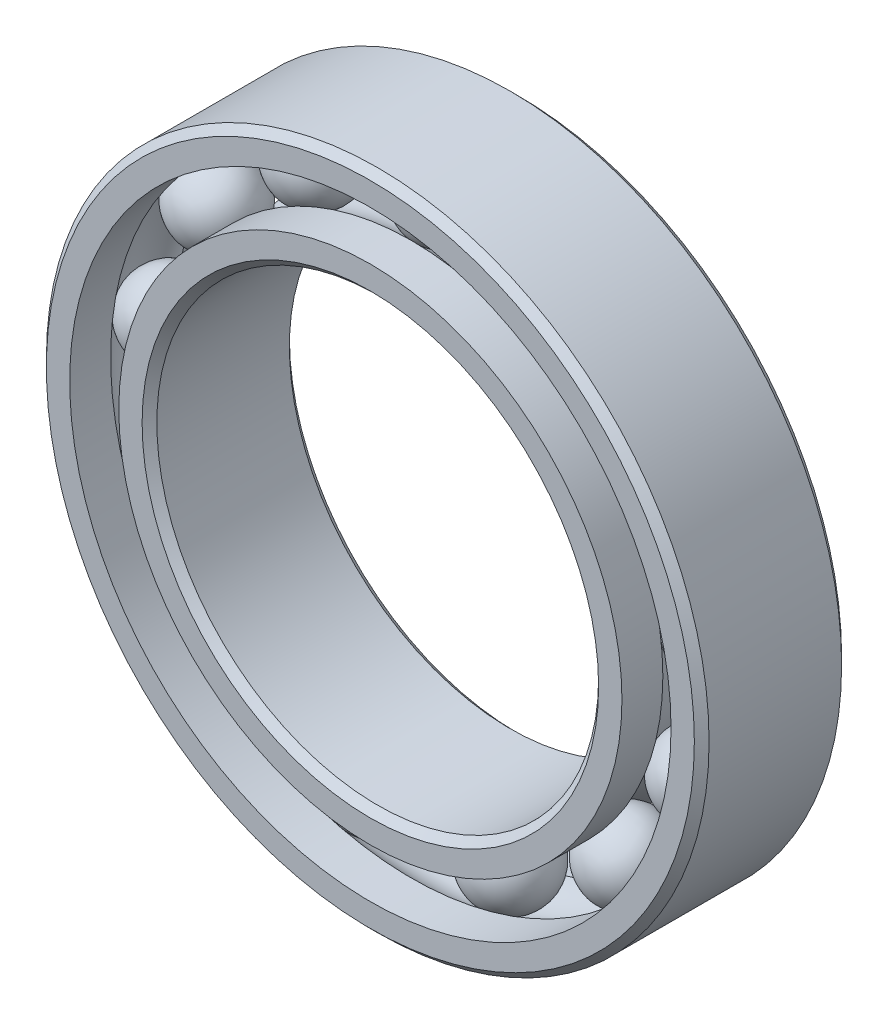
ISO-10303-21;
HEADER;
FILE_DESCRIPTION(('STEP AP214'),'2;1');
FILE_NAME('part.step','',(''),(''),'','','');
FILE_SCHEMA(('AUTOMOTIVE_DESIGN { 1 0 10303 214 1 1 1 1 }'));
ENDSEC;
DATA;
#1=APPLICATION_CONTEXT('core data for automotive mechanical design processes');
#2=APPLICATION_PROTOCOL_DEFINITION('international standard','automotive_design',2000,#1);
#3=PRODUCT_CONTEXT('',#1,'mechanical');
#4=PRODUCT('Part','Part','',(#3));
#5=PRODUCT_RELATED_PRODUCT_CATEGORY('part','',(#4));
#6=PRODUCT_DEFINITION_FORMATION('','',#4);
#7=PRODUCT_DEFINITION_CONTEXT('part definition',#1,'design');
#8=PRODUCT_DEFINITION('design','',#6,#7);
#9=PRODUCT_DEFINITION_SHAPE('','',#8);
#10=(LENGTH_UNIT() NAMED_UNIT(*) SI_UNIT(.MILLI.,.METRE.));
#11=(NAMED_UNIT(*) PLANE_ANGLE_UNIT() SI_UNIT($,.RADIAN.));
#12=(NAMED_UNIT(*) SI_UNIT($,.STERADIAN.) SOLID_ANGLE_UNIT());
#13=UNCERTAINTY_MEASURE_WITH_UNIT(LENGTH_MEASURE(1.E-05),#10,'distance_accuracy_value','');
#14=(GEOMETRIC_REPRESENTATION_CONTEXT(3) GLOBAL_UNCERTAINTY_ASSIGNED_CONTEXT((#13)) GLOBAL_UNIT_ASSIGNED_CONTEXT((#10,
#11,#12)) REPRESENTATION_CONTEXT('',''));
#15=CARTESIAN_POINT('',(0.,0.,0.));
#16=DIRECTION('',(0.,0.,1.));
#17=DIRECTION('',(1.,0.,0.));
#18=AXIS2_PLACEMENT_3D('',#15,#16,#17);
#19=CARTESIAN_POINT('',(3.48542379032818,6.64092019239912,0.));
#20=DIRECTION('',(0.,0.,1.));
#21=DIRECTION('',(0.464723172043757,0.885456025653216,0.));
#22=AXIS2_PLACEMENT_3D('',#19,#20,#21);
#23=SPHERICAL_SURFACE('',#22,1.11111111111111);
#24=CARTESIAN_POINT('',(3.48542379032818,6.64092019239912,1.11111111111111));
#25=VERTEX_POINT('',#24);
#26=VERTEX_LOOP('',#25);
#27=FACE_BOUND('',#26,.T.);
#28=ADVANCED_FACE('F45',(#27),#23,.T.);
#29=CLOSED_SHELL('',(#28));
#30=MANIFOLD_SOLID_BREP('B2',#29);
#31=CARTESIAN_POINT('',(6.17237899420237,4.26048560048374,0.));
#32=DIRECTION('',(0.,0.,1.));
#33=DIRECTION('',(0.822983865893649,0.568064746731166,0.));
#34=AXIS2_PLACEMENT_3D('',#31,#32,#33);
#35=SPHERICAL_SURFACE('',#34,1.11111111111111);
#36=CARTESIAN_POINT('',(6.17237899420237,4.26048560048374,1.11111111111111));
#37=VERTEX_POINT('',#36);
#38=VERTEX_LOOP('',#37);
#39=FACE_BOUND('',#38,.T.);
#40=ADVANCED_FACE('F65',(#39),#35,.T.);
#41=CLOSED_SHELL('',(#40));
#42=MANIFOLD_SOLID_BREP('B6',#41);
#43=CARTESIAN_POINT('',(7.4453165557354,0.904025101915004,0.));
#44=DIRECTION('',(0.,0.,1.));
#45=DIRECTION('',(0.992708874098053,0.120536680255334,0.));
#46=AXIS2_PLACEMENT_3D('',#43,#44,#45);
#47=SPHERICAL_SURFACE('',#46,1.11111111111111);
#48=CARTESIAN_POINT('',(7.4453165557354,0.904025101915004,1.11111111111111));
#49=VERTEX_POINT('',#48);
#50=VERTEX_LOOP('',#49);
#51=FACE_BOUND('',#50,.T.);
#52=ADVANCED_FACE('F85',(#51),#47,.T.);
#53=CLOSED_SHELL('',(#52));
#54=MANIFOLD_SOLID_BREP('B41',#53);
#55=CARTESIAN_POINT('',(7.01262182014064,-2.65953665281895,0.));
#56=DIRECTION('',(0.,0.,1.));
#57=DIRECTION('',(0.935016242685418,-0.354604887042527,0.));
#58=AXIS2_PLACEMENT_3D('',#55,#56,#57);
#59=SPHERICAL_SURFACE('',#58,1.11111111111111);
#60=CARTESIAN_POINT('',(7.01262182014064,-2.65953665281895,1.11111111111111));
#61=VERTEX_POINT('',#60);
#62=VERTEX_LOOP('',#61);
#63=FACE_BOUND('',#62,.T.);
#64=ADVANCED_FACE('F105',(#63),#59,.T.);
#65=CLOSED_SHELL('',(#64));
#66=MANIFOLD_SOLID_BREP('B61',#65);
#67=CARTESIAN_POINT('',(4.97341993680601,-5.61383061128322,0.));
#68=DIRECTION('',(0.,0.,1.));
#69=DIRECTION('',(0.663122658240802,-0.748510748171095,0.));
#70=AXIS2_PLACEMENT_3D('',#67,#68,#69);
#71=SPHERICAL_SURFACE('',#70,1.11111111111111);
#72=CARTESIAN_POINT('',(4.97341993680601,-5.61383061128322,1.11111111111111));
#73=VERTEX_POINT('',#72);
#74=VERTEX_LOOP('',#73);
#75=FACE_BOUND('',#74,.T.);
#76=ADVANCED_FACE('F125',(#75),#71,.T.);
#77=CLOSED_SHELL('',(#76));
#78=MANIFOLD_SOLID_BREP('B81',#77);
#79=CARTESIAN_POINT('',(1.79486748215674,-7.28206363069538,0.));
#80=DIRECTION('',(0.,0.,1.));
#81=DIRECTION('',(0.239315664287565,-0.97094181742605,0.));
#82=AXIS2_PLACEMENT_3D('',#79,#80,#81);
#83=SPHERICAL_SURFACE('',#82,1.11111111111111);
#84=CARTESIAN_POINT('',(1.79486748215674,-7.28206363069538,1.11111111111111));
#85=VERTEX_POINT('',#84);
#86=VERTEX_LOOP('',#85);
#87=FACE_BOUND('',#86,.T.);
#88=ADVANCED_FACE('F145',(#87),#83,.T.);
#89=CLOSED_SHELL('',(#88));
#90=MANIFOLD_SOLID_BREP('B101',#89);
#91=CARTESIAN_POINT('',(-1.79486748215664,-7.2820636306954,0.));
#92=DIRECTION('',(0.,0.,1.));
#93=DIRECTION('',(-0.239315664287552,-0.970941817426054,0.));
#94=AXIS2_PLACEMENT_3D('',#91,#92,#93);
#95=SPHERICAL_SURFACE('',#94,1.11111111111111);
#96=CARTESIAN_POINT('',(-1.79486748215664,-7.2820636306954,1.11111111111111));
#97=VERTEX_POINT('',#96);
#98=VERTEX_LOOP('',#97);
#99=FACE_BOUND('',#98,.T.);
#100=ADVANCED_FACE('F165',(#99),#95,.T.);
#101=CLOSED_SHELL('',(#100));
#102=MANIFOLD_SOLID_BREP('B121',#101);
#103=CARTESIAN_POINT('',(-4.97341993680593,-5.61383061128328,0.));
#104=DIRECTION('',(0.,0.,1.));
#105=DIRECTION('',(-0.663122658240791,-0.748510748171105,0.));
#106=AXIS2_PLACEMENT_3D('',#103,#104,#105);
#107=SPHERICAL_SURFACE('',#106,1.11111111111111);
#108=CARTESIAN_POINT('',(-4.97341993680593,-5.61383061128328,1.11111111111111));
#109=VERTEX_POINT('',#108);
#110=VERTEX_LOOP('',#109);
#111=FACE_BOUND('',#110,.T.);
#112=ADVANCED_FACE('F185',(#111),#107,.T.);
#113=CLOSED_SHELL('',(#112));
#114=MANIFOLD_SOLID_BREP('B141',#113);
#115=CARTESIAN_POINT('',(-7.0126218201406,-2.65953665281905,0.));
#116=DIRECTION('',(0.,0.,1.));
#117=DIRECTION('',(-0.935016242685413,-0.35460488704254,0.));
#118=AXIS2_PLACEMENT_3D('',#115,#116,#117);
#119=SPHERICAL_SURFACE('',#118,1.11111111111111);
#120=CARTESIAN_POINT('',(-7.0126218201406,-2.65953665281905,1.11111111111111));
#121=VERTEX_POINT('',#120);
#122=VERTEX_LOOP('',#121);
#123=FACE_BOUND('',#122,.T.);
#124=ADVANCED_FACE('F205',(#123),#119,.T.);
#125=CLOSED_SHELL('',(#124));
#126=MANIFOLD_SOLID_BREP('B161',#125);
#127=CARTESIAN_POINT('',(-7.44531655573541,0.904025101914899,0.));
#128=DIRECTION('',(0.,0.,1.));
#129=DIRECTION('',(-0.992708874098054,0.12053668025532,0.));
#130=AXIS2_PLACEMENT_3D('',#127,#128,#129);
#131=SPHERICAL_SURFACE('',#130,1.11111111111111);
#132=CARTESIAN_POINT('',(-7.44531655573541,0.904025101914899,1.11111111111111));
#133=VERTEX_POINT('',#132);
#134=VERTEX_LOOP('',#133);
#135=FACE_BOUND('',#134,.T.);
#136=ADVANCED_FACE('F225',(#135),#131,.T.);
#137=CLOSED_SHELL('',(#136));
#138=MANIFOLD_SOLID_BREP('B181',#137);
#139=CARTESIAN_POINT('',(-6.17237899420243,4.26048560048366,0.));
#140=DIRECTION('',(0.,0.,1.));
#141=DIRECTION('',(-0.822983865893658,0.568064746731154,0.));
#142=AXIS2_PLACEMENT_3D('',#139,#140,#141);
#143=SPHERICAL_SURFACE('',#142,1.11111111111111);
#144=CARTESIAN_POINT('',(-6.17237899420243,4.26048560048366,1.11111111111111));
#145=VERTEX_POINT('',#144);
#146=VERTEX_LOOP('',#145);
#147=FACE_BOUND('',#146,.T.);
#148=ADVANCED_FACE('F245',(#147),#143,.T.);
#149=CLOSED_SHELL('',(#148));
#150=MANIFOLD_SOLID_BREP('B201',#149);
#151=CARTESIAN_POINT('',(-3.48542379032827,6.64092019239907,0.));
#152=DIRECTION('',(0.,0.,1.));
#153=DIRECTION('',(-0.46472317204377,0.885456025653209,0.));
#154=AXIS2_PLACEMENT_3D('',#151,#152,#153);
#155=SPHERICAL_SURFACE('',#154,1.11111111111111);
#156=CARTESIAN_POINT('',(-3.48542379032827,6.64092019239907,1.11111111111111));
#157=VERTEX_POINT('',#156);
#158=VERTEX_LOOP('',#157);
#159=FACE_BOUND('',#158,.T.);
#160=ADVANCED_FACE('F265',(#159),#155,.T.);
#161=CLOSED_SHELL('',(#160));
#162=MANIFOLD_SOLID_BREP('B221',#161);
#163=CARTESIAN_POINT('',(0.,7.5,0.));
#164=DIRECTION('',(0.,0.,1.));
#165=DIRECTION('',(0.,1.,0.));
#166=AXIS2_PLACEMENT_3D('',#163,#164,#165);
#167=SPHERICAL_SURFACE('',#166,1.11111111111111);
#168=CARTESIAN_POINT('',(0.,7.5,1.11111111111111));
#169=VERTEX_POINT('',#168);
#170=VERTEX_LOOP('',#169);
#171=FACE_BOUND('',#170,.T.);
#172=ADVANCED_FACE('F287',(#171),#167,.T.);
#173=CLOSED_SHELL('',(#172));
#174=MANIFOLD_SOLID_BREP('B241',#173);
#175=CARTESIAN_POINT('',(0.,6.83333333333333,2.));
#176=DIRECTION('',(0.,0.,-1.));
#177=DIRECTION('',(-1.,0.,0.));
#178=AXIS2_PLACEMENT_3D('',#175,#176,#177);
#179=PLANE('',#178);
#180=CARTESIAN_POINT('',(0.,0.,2.));
#181=DIRECTION('',(0.,0.,1.));
#182=DIRECTION('',(1.,0.,0.));
#183=AXIS2_PLACEMENT_3D('',#180,#181,#182);
#184=CIRCLE('',#183,6.2);
#185=CARTESIAN_POINT('',(6.2,0.,2.));
#186=VERTEX_POINT('',#185);
#187=EDGE_CURVE('E334',#186,#186,#184,.T.);
#188=ORIENTED_EDGE('',*,*,#187,.F.);
#189=EDGE_LOOP('',(#188));
#190=FACE_BOUND('',#189,.T.);
#191=CARTESIAN_POINT('',(0.,0.,2.));
#192=DIRECTION('',(0.,0.,1.));
#193=DIRECTION('',(1.,0.,0.));
#194=AXIS2_PLACEMENT_3D('',#191,#192,#193);
#195=CIRCLE('',#194,6.83333333333333);
#196=CARTESIAN_POINT('',(6.83333333333333,0.,2.));
#197=VERTEX_POINT('',#196);
#198=EDGE_CURVE('E286',#197,#197,#195,.T.);
#199=ORIENTED_EDGE('',*,*,#198,.T.);
#200=EDGE_LOOP('',(#199));
#201=FACE_BOUND('',#200,.T.);
#202=ADVANCED_FACE('F306',(#190,#201),#179,.F.);
#203=CARTESIAN_POINT('',(0.,0.,2.));
#204=DIRECTION('',(0.,0.,1.));
#205=DIRECTION('',(1.,0.,0.));
#206=AXIS2_PLACEMENT_3D('',#203,#204,#205);
#207=CYLINDRICAL_SURFACE('',#206,6.83333333333333);
#208=ORIENTED_EDGE('',*,*,#198,.F.);
#209=EDGE_LOOP('',(#208));
#210=FACE_BOUND('',#209,.T.);
#211=CARTESIAN_POINT('',(0.,0.,0.888888888888889));
#212=DIRECTION('',(0.,0.,1.));
#213=DIRECTION('',(1.,0.,0.));
#214=AXIS2_PLACEMENT_3D('',#211,#212,#213);
#215=CIRCLE('',#214,6.83333333333333);
#216=CARTESIAN_POINT('',(6.83333333333333,0.,0.888888888888889));
#217=VERTEX_POINT('',#216);
#218=EDGE_CURVE('E312',#217,#217,#215,.T.);
#219=ORIENTED_EDGE('',*,*,#218,.T.);
#220=EDGE_LOOP('',(#219));
#221=FACE_BOUND('',#220,.T.);
#222=ADVANCED_FACE('F341',(#210,#221),#207,.T.);
#223=CARTESIAN_POINT('',(0.,0.,0.));
#224=DIRECTION('',(0.,0.,1.));
#225=DIRECTION('',(1.,0.,0.));
#226=AXIS2_PLACEMENT_3D('',#223,#224,#225);
#227=TOROIDAL_SURFACE('',#226,7.5,1.11111111111111);
#228=ORIENTED_EDGE('',*,*,#218,.F.);
#229=EDGE_LOOP('',(#228));
#230=FACE_BOUND('',#229,.T.);
#231=CARTESIAN_POINT('',(0.,0.,-0.888888888888889));
#232=DIRECTION('',(0.,0.,1.));
#233=DIRECTION('',(1.,0.,0.));
#234=AXIS2_PLACEMENT_3D('',#231,#232,#233);
#235=CIRCLE('',#234,6.83333333333333);
#236=CARTESIAN_POINT('',(6.83333333333333,0.,-0.888888888888889));
#237=VERTEX_POINT('',#236);
#238=EDGE_CURVE('E316',#237,#237,#235,.T.);
#239=ORIENTED_EDGE('',*,*,#238,.T.);
#240=EDGE_LOOP('',(#239));
#241=FACE_BOUND('',#240,.T.);
#242=ADVANCED_FACE('F345',(#230,#241),#227,.F.);
#243=CARTESIAN_POINT('',(0.,0.,2.));
#244=DIRECTION('',(0.,0.,1.));
#245=DIRECTION('',(1.,0.,0.));
#246=AXIS2_PLACEMENT_3D('',#243,#244,#245);
#247=CYLINDRICAL_SURFACE('',#246,6.83333333333333);
#248=ORIENTED_EDGE('',*,*,#238,.F.);
#249=EDGE_LOOP('',(#248));
#250=FACE_BOUND('',#249,.T.);
#251=CARTESIAN_POINT('',(0.,0.,-2.));
#252=DIRECTION('',(0.,0.,1.));
#253=DIRECTION('',(1.,0.,0.));
#254=AXIS2_PLACEMENT_3D('',#251,#252,#253);
#255=CIRCLE('',#254,6.83333333333333);
#256=CARTESIAN_POINT('',(6.83333333333333,0.,-2.));
#257=VERTEX_POINT('',#256);
#258=EDGE_CURVE('E320',#257,#257,#255,.T.);
#259=ORIENTED_EDGE('',*,*,#258,.T.);
#260=EDGE_LOOP('',(#259));
#261=FACE_BOUND('',#260,.T.);
#262=ADVANCED_FACE('F350',(#250,#261),#247,.T.);
#263=CARTESIAN_POINT('',(0.,6.2,-2.));
#264=DIRECTION('',(0.,0.,1.));
#265=DIRECTION('',(1.,0.,0.));
#266=AXIS2_PLACEMENT_3D('',#263,#264,#265);
#267=PLANE('',#266);
#268=ORIENTED_EDGE('',*,*,#258,.F.);
#269=EDGE_LOOP('',(#268));
#270=FACE_BOUND('',#269,.T.);
#271=CARTESIAN_POINT('',(0.,0.,-2.));
#272=DIRECTION('',(0.,0.,1.));
#273=DIRECTION('',(1.,0.,0.));
#274=AXIS2_PLACEMENT_3D('',#271,#272,#273);
#275=CIRCLE('',#274,6.2);
#276=CARTESIAN_POINT('',(6.2,0.,-2.));
#277=VERTEX_POINT('',#276);
#278=EDGE_CURVE('E325',#277,#277,#275,.T.);
#279=ORIENTED_EDGE('',*,*,#278,.T.);
#280=EDGE_LOOP('',(#279));
#281=FACE_BOUND('',#280,.T.);
#282=ADVANCED_FACE('F356',(#270,#281),#267,.F.);
#283=CARTESIAN_POINT('',(0.,0.,-1.8));
#284=DIRECTION('',(0.,0.,-1.));
#285=DIRECTION('',(-1.,0.,0.));
#286=AXIS2_PLACEMENT_3D('',#283,#284,#285);
#287=CONICAL_SURFACE('',#286,6.,0.785398163397448);
#288=ORIENTED_EDGE('',*,*,#278,.F.);
#289=EDGE_LOOP('',(#288));
#290=FACE_BOUND('',#289,.T.);
#291=CARTESIAN_POINT('',(0.,0.,-1.8));
#292=DIRECTION('',(0.,0.,1.));
#293=DIRECTION('',(1.,0.,0.));
#294=AXIS2_PLACEMENT_3D('',#291,#292,#293);
#295=CIRCLE('',#294,6.);
#296=CARTESIAN_POINT('',(6.,0.,-1.8));
#297=VERTEX_POINT('',#296);
#298=EDGE_CURVE('E328',#297,#297,#295,.T.);
#299=ORIENTED_EDGE('',*,*,#298,.T.);
#300=EDGE_LOOP('',(#299));
#301=FACE_BOUND('',#300,.T.);
#302=ADVANCED_FACE('F360',(#290,#301),#287,.F.);
#303=CARTESIAN_POINT('',(0.,0.,2.));
#304=DIRECTION('',(0.,0.,1.));
#305=DIRECTION('',(1.,0.,0.));
#306=AXIS2_PLACEMENT_3D('',#303,#304,#305);
#307=CYLINDRICAL_SURFACE('',#306,6.);
#308=ORIENTED_EDGE('',*,*,#298,.F.);
#309=EDGE_LOOP('',(#308));
#310=FACE_BOUND('',#309,.T.);
#311=CARTESIAN_POINT('',(0.,0.,1.8));
#312=DIRECTION('',(0.,0.,1.));
#313=DIRECTION('',(1.,0.,0.));
#314=AXIS2_PLACEMENT_3D('',#311,#312,#313);
#315=CIRCLE('',#314,6.);
#316=CARTESIAN_POINT('',(6.,0.,1.8));
#317=VERTEX_POINT('',#316);
#318=EDGE_CURVE('E331',#317,#317,#315,.T.);
#319=ORIENTED_EDGE('',*,*,#318,.T.);
#320=EDGE_LOOP('',(#319));
#321=FACE_BOUND('',#320,.T.);
#322=ADVANCED_FACE('F364',(#310,#321),#307,.F.);
#323=CARTESIAN_POINT('',(0.,0.,2.));
#324=DIRECTION('',(0.,0.,1.));
#325=DIRECTION('',(1.,0.,0.));
#326=AXIS2_PLACEMENT_3D('',#323,#324,#325);
#327=CONICAL_SURFACE('',#326,6.2,0.78539816339744);
#328=ORIENTED_EDGE('',*,*,#318,.F.);
#329=EDGE_LOOP('',(#328));
#330=FACE_BOUND('',#329,.T.);
#331=ORIENTED_EDGE('',*,*,#187,.T.);
#332=EDGE_LOOP('',(#331));
#333=FACE_BOUND('',#332,.T.);
#334=ADVANCED_FACE('F338',(#330,#333),#327,.F.);
#335=CLOSED_SHELL('',(#202,#222,#242,#262,#282,#302,#322,#334));
#336=MANIFOLD_SOLID_BREP('B261',#335);
#337=CARTESIAN_POINT('',(0.,0.,1.8));
#338=DIRECTION('',(0.,0.,-1.));
#339=DIRECTION('',(-1.,0.,0.));
#340=AXIS2_PLACEMENT_3D('',#337,#338,#339);
#341=CONICAL_SURFACE('',#340,9.,0.785398163397446);
#342=CARTESIAN_POINT('',(0.,0.,2.));
#343=DIRECTION('',(0.,0.,1.));
#344=DIRECTION('',(1.,0.,0.));
#345=AXIS2_PLACEMENT_3D('',#342,#343,#344);
#346=CIRCLE('',#345,8.8);
#347=CARTESIAN_POINT('',(8.8,0.,2.));
#348=VERTEX_POINT('',#347);
#349=EDGE_CURVE('E460',#348,#348,#346,.T.);
#350=ORIENTED_EDGE('',*,*,#349,.F.);
#351=EDGE_LOOP('',(#350));
#352=FACE_BOUND('',#351,.T.);
#353=CARTESIAN_POINT('',(0.,0.,1.8));
#354=DIRECTION('',(0.,0.,1.));
#355=DIRECTION('',(1.,0.,0.));
#356=AXIS2_PLACEMENT_3D('',#353,#354,#355);
#357=CIRCLE('',#356,9.);
#358=CARTESIAN_POINT('',(9.,0.,1.8));
#359=VERTEX_POINT('',#358);
#360=EDGE_CURVE('E305',#359,#359,#357,.T.);
#361=ORIENTED_EDGE('',*,*,#360,.T.);
#362=EDGE_LOOP('',(#361));
#363=FACE_BOUND('',#362,.T.);
#364=ADVANCED_FACE('F432',(#352,#363),#341,.T.);
#365=CARTESIAN_POINT('',(0.,0.,2.));
#366=DIRECTION('',(0.,0.,1.));
#367=DIRECTION('',(1.,0.,0.));
#368=AXIS2_PLACEMENT_3D('',#365,#366,#367);
#369=CYLINDRICAL_SURFACE('',#368,9.);
#370=ORIENTED_EDGE('',*,*,#360,.F.);
#371=EDGE_LOOP('',(#370));
#372=FACE_BOUND('',#371,.T.);
#373=CARTESIAN_POINT('',(0.,0.,-1.8));
#374=DIRECTION('',(0.,0.,1.));
#375=DIRECTION('',(1.,0.,0.));
#376=AXIS2_PLACEMENT_3D('',#373,#374,#375);
#377=CIRCLE('',#376,9.);
#378=CARTESIAN_POINT('',(9.,0.,-1.8));
#379=VERTEX_POINT('',#378);
#380=EDGE_CURVE('E438',#379,#379,#377,.T.);
#381=ORIENTED_EDGE('',*,*,#380,.T.);
#382=EDGE_LOOP('',(#381));
#383=FACE_BOUND('',#382,.T.);
#384=ADVANCED_FACE('F467',(#372,#383),#369,.T.);
#385=CARTESIAN_POINT('',(0.,0.,-2.));
#386=DIRECTION('',(0.,0.,1.));
#387=DIRECTION('',(1.,0.,0.));
#388=AXIS2_PLACEMENT_3D('',#385,#386,#387);
#389=CONICAL_SURFACE('',#388,8.8,0.785398163397448);
#390=ORIENTED_EDGE('',*,*,#380,.F.);
#391=EDGE_LOOP('',(#390));
#392=FACE_BOUND('',#391,.T.);
#393=CARTESIAN_POINT('',(0.,0.,-2.));
#394=DIRECTION('',(0.,0.,1.));
#395=DIRECTION('',(1.,0.,0.));
#396=AXIS2_PLACEMENT_3D('',#393,#394,#395);
#397=CIRCLE('',#396,8.8);
#398=CARTESIAN_POINT('',(8.8,0.,-2.));
#399=VERTEX_POINT('',#398);
#400=EDGE_CURVE('E442',#399,#399,#397,.T.);
#401=ORIENTED_EDGE('',*,*,#400,.T.);
#402=EDGE_LOOP('',(#401));
#403=FACE_BOUND('',#402,.T.);
#404=ADVANCED_FACE('F471',(#392,#403),#389,.T.);
#405=CARTESIAN_POINT('',(0.,8.8,-2.));
#406=DIRECTION('',(0.,0.,1.));
#407=DIRECTION('',(1.,0.,0.));
#408=AXIS2_PLACEMENT_3D('',#405,#406,#407);
#409=PLANE('',#408);
#410=ORIENTED_EDGE('',*,*,#400,.F.);
#411=EDGE_LOOP('',(#410));
#412=FACE_BOUND('',#411,.T.);
#413=CARTESIAN_POINT('',(0.,0.,-2.));
#414=DIRECTION('',(0.,0.,1.));
#415=DIRECTION('',(1.,0.,0.));
#416=AXIS2_PLACEMENT_3D('',#413,#414,#415);
#417=CIRCLE('',#416,8.16666666666667);
#418=CARTESIAN_POINT('',(8.16666666666667,0.,-2.));
#419=VERTEX_POINT('',#418);
#420=EDGE_CURVE('E446',#419,#419,#417,.T.);
#421=ORIENTED_EDGE('',*,*,#420,.T.);
#422=EDGE_LOOP('',(#421));
#423=FACE_BOUND('',#422,.T.);
#424=ADVANCED_FACE('F476',(#412,#423),#409,.F.);
#425=CARTESIAN_POINT('',(0.,0.,2.));
#426=DIRECTION('',(0.,0.,1.));
#427=DIRECTION('',(1.,0.,0.));
#428=AXIS2_PLACEMENT_3D('',#425,#426,#427);
#429=CYLINDRICAL_SURFACE('',#428,8.16666666666667);
#430=ORIENTED_EDGE('',*,*,#420,.F.);
#431=EDGE_LOOP('',(#430));
#432=FACE_BOUND('',#431,.T.);
#433=CARTESIAN_POINT('',(0.,0.,-0.88888888888889));
#434=DIRECTION('',(0.,0.,1.));
#435=DIRECTION('',(1.,0.,0.));
#436=AXIS2_PLACEMENT_3D('',#433,#434,#435);
#437=CIRCLE('',#436,8.16666666666667);
#438=CARTESIAN_POINT('',(8.16666666666667,0.,-0.88888888888889));
#439=VERTEX_POINT('',#438);
#440=EDGE_CURVE('E451',#439,#439,#437,.T.);
#441=ORIENTED_EDGE('',*,*,#440,.T.);
#442=EDGE_LOOP('',(#441));
#443=FACE_BOUND('',#442,.T.);
#444=ADVANCED_FACE('F482',(#432,#443),#429,.F.);
#445=CARTESIAN_POINT('',(0.,0.,0.));
#446=DIRECTION('',(0.,0.,1.));
#447=DIRECTION('',(1.,0.,0.));
#448=AXIS2_PLACEMENT_3D('',#445,#446,#447);
#449=TOROIDAL_SURFACE('',#448,7.5,1.11111111111111);
#450=ORIENTED_EDGE('',*,*,#440,.F.);
#451=EDGE_LOOP('',(#450));
#452=FACE_BOUND('',#451,.T.);
#453=CARTESIAN_POINT('',(0.,0.,0.888888888888889));
#454=DIRECTION('',(0.,0.,1.));
#455=DIRECTION('',(1.,0.,0.));
#456=AXIS2_PLACEMENT_3D('',#453,#454,#455);
#457=CIRCLE('',#456,8.16666666666667);
#458=CARTESIAN_POINT('',(8.16666666666667,0.,0.888888888888889));
#459=VERTEX_POINT('',#458);
#460=EDGE_CURVE('E454',#459,#459,#457,.T.);
#461=ORIENTED_EDGE('',*,*,#460,.T.);
#462=EDGE_LOOP('',(#461));
#463=FACE_BOUND('',#462,.T.);
#464=ADVANCED_FACE('F486',(#452,#463),#449,.F.);
#465=CARTESIAN_POINT('',(0.,0.,2.));
#466=DIRECTION('',(0.,0.,1.));
#467=DIRECTION('',(1.,0.,0.));
#468=AXIS2_PLACEMENT_3D('',#465,#466,#467);
#469=CYLINDRICAL_SURFACE('',#468,8.16666666666667);
#470=ORIENTED_EDGE('',*,*,#460,.F.);
#471=EDGE_LOOP('',(#470));
#472=FACE_BOUND('',#471,.T.);
#473=CARTESIAN_POINT('',(0.,0.,2.));
#474=DIRECTION('',(0.,0.,1.));
#475=DIRECTION('',(1.,0.,0.));
#476=AXIS2_PLACEMENT_3D('',#473,#474,#475);
#477=CIRCLE('',#476,8.16666666666667);
#478=CARTESIAN_POINT('',(8.16666666666667,0.,2.));
#479=VERTEX_POINT('',#478);
#480=EDGE_CURVE('E457',#479,#479,#477,.T.);
#481=ORIENTED_EDGE('',*,*,#480,.T.);
#482=EDGE_LOOP('',(#481));
#483=FACE_BOUND('',#482,.T.);
#484=ADVANCED_FACE('F490',(#472,#483),#469,.F.);
#485=CARTESIAN_POINT('',(0.,8.8,2.));
#486=DIRECTION('',(0.,0.,-1.));
#487=DIRECTION('',(-1.,0.,0.));
#488=AXIS2_PLACEMENT_3D('',#485,#486,#487);
#489=PLANE('',#488);
#490=ORIENTED_EDGE('',*,*,#480,.F.);
#491=EDGE_LOOP('',(#490));
#492=FACE_BOUND('',#491,.T.);
#493=ORIENTED_EDGE('',*,*,#349,.T.);
#494=EDGE_LOOP('',(#493));
#495=FACE_BOUND('',#494,.T.);
#496=ADVANCED_FACE('F464',(#492,#495),#489,.F.);
#497=CLOSED_SHELL('',(#364,#384,#404,#424,#444,#464,#484,#496));
#498=MANIFOLD_SOLID_BREP('B281',#497);
#499=ADVANCED_BREP_SHAPE_REPRESENTATION('',(#18,#30,#42,#54,#66,#78,#90,#102,#114,#126,#138,
#150,#162,#174,#336,#498),#14);
#500=SHAPE_DEFINITION_REPRESENTATION(#9,#499);
ENDSEC;
END-ISO-10303-21;
